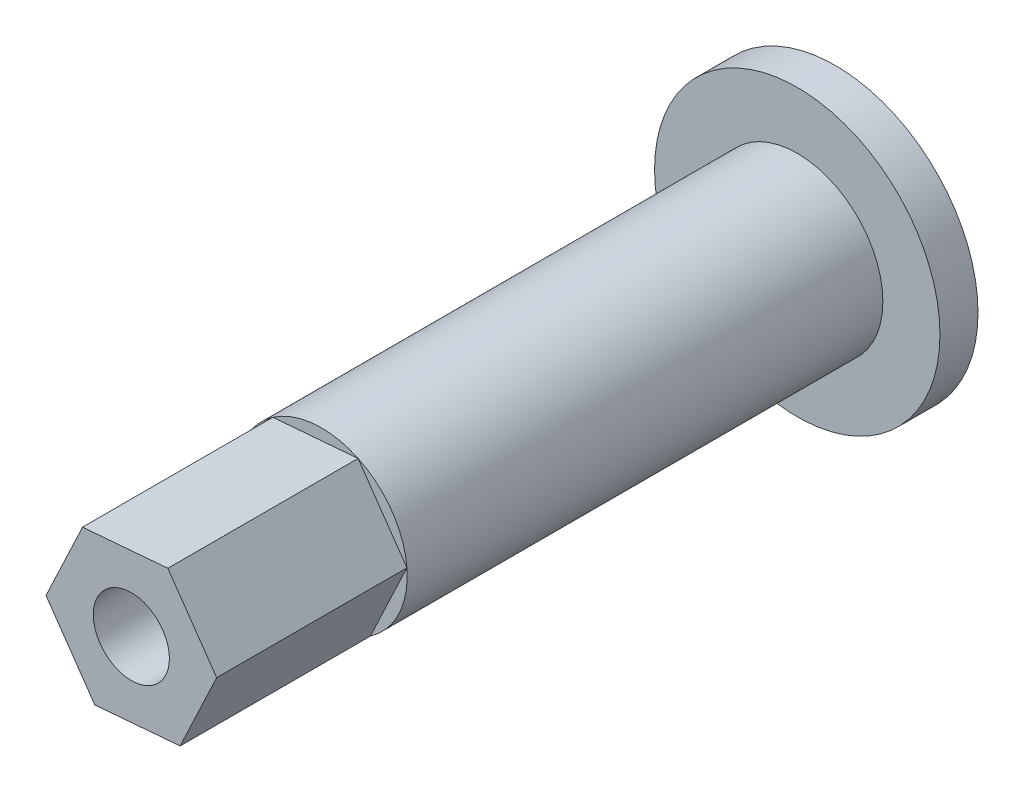
ISO-10303-21;
HEADER;
FILE_DESCRIPTION(('STEP AP214'),'2;1');
FILE_NAME('part.step','',(''),(''),'','','');
FILE_SCHEMA(('AUTOMOTIVE_DESIGN { 1 0 10303 214 1 1 1 1 }'));
ENDSEC;
DATA;
#1=APPLICATION_CONTEXT('core data for automotive mechanical design processes');
#2=APPLICATION_PROTOCOL_DEFINITION('international standard','automotive_design',2000,#1);
#3=PRODUCT_CONTEXT('',#1,'mechanical');
#4=PRODUCT('Part','Part','',(#3));
#5=PRODUCT_RELATED_PRODUCT_CATEGORY('part','',(#4));
#6=PRODUCT_DEFINITION_FORMATION('','',#4);
#7=PRODUCT_DEFINITION_CONTEXT('part definition',#1,'design');
#8=PRODUCT_DEFINITION('design','',#6,#7);
#9=PRODUCT_DEFINITION_SHAPE('','',#8);
#10=(LENGTH_UNIT() NAMED_UNIT(*) SI_UNIT(.MILLI.,.METRE.));
#11=(NAMED_UNIT(*) PLANE_ANGLE_UNIT() SI_UNIT($,.RADIAN.));
#12=(NAMED_UNIT(*) SI_UNIT($,.STERADIAN.) SOLID_ANGLE_UNIT());
#13=UNCERTAINTY_MEASURE_WITH_UNIT(LENGTH_MEASURE(1.E-05),#10,'distance_accuracy_value','');
#14=(GEOMETRIC_REPRESENTATION_CONTEXT(3) GLOBAL_UNCERTAINTY_ASSIGNED_CONTEXT((#13)) GLOBAL_UNIT_ASSIGNED_CONTEXT((#10,
#11,#12)) REPRESENTATION_CONTEXT('',''));
#15=CARTESIAN_POINT('',(0.,0.,0.));
#16=DIRECTION('',(0.,0.,1.));
#17=DIRECTION('',(1.,0.,0.));
#18=AXIS2_PLACEMENT_3D('',#15,#16,#17);
#19=CARTESIAN_POINT('',(0.,0.,25.));
#20=DIRECTION('',(0.,0.,1.));
#21=DIRECTION('',(1.,0.,0.));
#22=AXIS2_PLACEMENT_3D('',#19,#20,#21);
#23=PLANE('',#22);
#24=DIRECTION('',(-0.569748496318656,0.821819110840476,0.));
#25=VECTOR('',#24,1.);
#26=CARTESIAN_POINT('',(4.48465713958224,0.371282022718662,25.));
#27=LINE('',#26,#25);
#28=CARTESIAN_POINT('',(4.48465713958224,0.371282022718665,25.));
#29=VERTEX_POINT('',#28);
#30=CARTESIAN_POINT('',(1.92078890614829,4.0694680215008,25.));
#31=VERTEX_POINT('',#30);
#32=EDGE_CURVE('E150',#29,#31,#27,.T.);
#33=ORIENTED_EDGE('',*,*,#32,.F.);
#34=CARTESIAN_POINT('',(0.,0.,25.));
#35=DIRECTION('',(0.,0.,1.));
#36=DIRECTION('',(1.,0.,0.));
#37=AXIS2_PLACEMENT_3D('',#34,#35,#36);
#38=CIRCLE('',#37,4.5);
#39=EDGE_CURVE('E159',#29,#31,#38,.T.);
#40=ORIENTED_EDGE('',*,*,#39,.T.);
#41=EDGE_LOOP('',(#33,#40));
#42=FACE_BOUND('',#41,.T.);
#43=ADVANCED_FACE('F46',(#42),#23,.T.);
#44=DIRECTION('',(0.426841979144064,0.904326227000179,0.));
#45=VECTOR('',#44,1.);
#46=CARTESIAN_POINT('',(2.56386823343395,-3.69818599878214,25.));
#47=LINE('',#46,#45);
#48=CARTESIAN_POINT('',(2.56386823343395,-3.69818599878214,25.));
#49=VERTEX_POINT('',#48);
#50=EDGE_CURVE('E61',#49,#29,#47,.T.);
#51=ORIENTED_EDGE('',*,*,#50,.F.);
#52=EDGE_CURVE('E152',#49,#29,#38,.T.);
#53=ORIENTED_EDGE('',*,*,#52,.T.);
#54=EDGE_LOOP('',(#51,#53));
#55=FACE_BOUND('',#54,.T.);
#56=ADVANCED_FACE('F248',(#55),#23,.T.);
#57=DIRECTION('',(0.99659047546272,0.0825071161597027,0.));
#58=VECTOR('',#57,1.);
#59=CARTESIAN_POINT('',(-1.92078890614828,-4.0694680215008,25.));
#60=LINE('',#59,#58);
#61=CARTESIAN_POINT('',(-1.92078890614828,-4.06946802150081,25.));
#62=VERTEX_POINT('',#61);
#63=EDGE_CURVE('E68',#62,#49,#60,.T.);
#64=ORIENTED_EDGE('',*,*,#63,.F.);
#65=EDGE_CURVE('E157',#62,#49,#38,.T.);
#66=ORIENTED_EDGE('',*,*,#65,.T.);
#67=EDGE_LOOP('',(#64,#66));
#68=FACE_BOUND('',#67,.T.);
#69=ADVANCED_FACE('F253',(#68),#23,.T.);
#70=DIRECTION('',(0.569748496318656,-0.821819110840476,0.));
#71=VECTOR('',#70,1.);
#72=CARTESIAN_POINT('',(-4.48465713958223,-0.371282022718662,25.));
#73=LINE('',#72,#71);
#74=CARTESIAN_POINT('',(-4.48465713958224,-0.371282022718668,25.));
#75=VERTEX_POINT('',#74);
#76=EDGE_CURVE('E293',#75,#62,#73,.T.);
#77=ORIENTED_EDGE('',*,*,#76,.F.);
#78=EDGE_CURVE('E282',#75,#62,#38,.T.);
#79=ORIENTED_EDGE('',*,*,#78,.T.);
#80=EDGE_LOOP('',(#77,#79));
#81=FACE_BOUND('',#80,.T.);
#82=ADVANCED_FACE('F243',(#81),#23,.T.);
#83=DIRECTION('',(-0.426841979144064,-0.904326227000179,0.));
#84=VECTOR('',#83,1.);
#85=CARTESIAN_POINT('',(-2.56386823343395,3.69818599878214,25.));
#86=LINE('',#85,#84);
#87=CARTESIAN_POINT('',(-2.56386823343395,3.69818599878214,25.));
#88=VERTEX_POINT('',#87);
#89=EDGE_CURVE('E267',#88,#75,#86,.T.);
#90=ORIENTED_EDGE('',*,*,#89,.F.);
#91=EDGE_CURVE('E274',#88,#75,#38,.T.);
#92=ORIENTED_EDGE('',*,*,#91,.T.);
#93=EDGE_LOOP('',(#90,#92));
#94=FACE_BOUND('',#93,.T.);
#95=ADVANCED_FACE('F238',(#94),#23,.T.);
#96=CARTESIAN_POINT('',(0.,0.,10.));
#97=DIRECTION('',(0.,0.,-1.));
#98=DIRECTION('',(-1.,0.,0.));
#99=AXIS2_PLACEMENT_3D('',#96,#97,#98);
#100=CYLINDRICAL_SURFACE('',#99,2.7);
#101=DIRECTION('',(0.,0.,-1.));
#102=VECTOR('',#101,1.);
#103=CARTESIAN_POINT('',(-1.85,1.96659604392971,10.));
#104=LINE('',#103,#102);
#105=CARTESIAN_POINT('',(-1.85,1.96659604392971,10.));
#106=VERTEX_POINT('',#105);
#107=CARTESIAN_POINT('',(-1.85,1.96659604392971,-2.));
#108=VERTEX_POINT('',#107);
#109=EDGE_CURVE('E205',#106,#108,#104,.T.);
#110=ORIENTED_EDGE('',*,*,#109,.T.);
#111=CARTESIAN_POINT('',(0.,0.,-2.));
#112=DIRECTION('',(0.,0.,-1.));
#113=DIRECTION('',(-1.,0.,0.));
#114=AXIS2_PLACEMENT_3D('',#111,#112,#113);
#115=CIRCLE('',#114,2.7);
#116=CARTESIAN_POINT('',(1.85,1.96659604392972,-2.));
#117=VERTEX_POINT('',#116);
#118=EDGE_CURVE('E167',#108,#117,#115,.T.);
#119=ORIENTED_EDGE('',*,*,#118,.T.);
#120=DIRECTION('',(0.,0.,-1.));
#121=VECTOR('',#120,1.);
#122=CARTESIAN_POINT('',(1.85,1.96659604392972,10.));
#123=LINE('',#122,#121);
#124=CARTESIAN_POINT('',(1.85,1.96659604392972,10.));
#125=VERTEX_POINT('',#124);
#126=EDGE_CURVE('E11',#125,#117,#123,.T.);
#127=ORIENTED_EDGE('',*,*,#126,.F.);
#128=CARTESIAN_POINT('',(0.,0.,10.));
#129=DIRECTION('',(0.,0.,1.));
#130=DIRECTION('',(1.,0.,0.));
#131=AXIS2_PLACEMENT_3D('',#128,#129,#130);
#132=CIRCLE('',#131,2.7);
#133=EDGE_CURVE('E193',#106,#125,#132,.F.);
#134=ORIENTED_EDGE('',*,*,#133,.F.);
#135=EDGE_LOOP('',(#110,#119,#127,#134));
#136=FACE_BOUND('',#135,.T.);
#137=ADVANCED_FACE('F48',(#136),#100,.F.);
#138=CARTESIAN_POINT('',(1.85,0.,10.));
#139=DIRECTION('',(1.,0.,0.));
#140=DIRECTION('',(0.,0.,-1.));
#141=AXIS2_PLACEMENT_3D('',#138,#139,#140);
#142=PLANE('',#141);
#143=ORIENTED_EDGE('',*,*,#126,.T.);
#144=DIRECTION('',(0.,-1.,0.));
#145=VECTOR('',#144,1.);
#146=CARTESIAN_POINT('',(1.85,1.96659604392972,-2.));
#147=LINE('',#146,#145);
#148=CARTESIAN_POINT('',(1.85,-1.96659604392972,-2.));
#149=VERTEX_POINT('',#148);
#150=EDGE_CURVE('E172',#117,#149,#147,.T.);
#151=ORIENTED_EDGE('',*,*,#150,.T.);
#152=DIRECTION('',(0.,0.,-1.));
#153=VECTOR('',#152,1.);
#154=CARTESIAN_POINT('',(1.85,-1.96659604392972,10.));
#155=LINE('',#154,#153);
#156=CARTESIAN_POINT('',(1.85,-1.96659604392972,10.));
#157=VERTEX_POINT('',#156);
#158=EDGE_CURVE('E55',#157,#149,#155,.T.);
#159=ORIENTED_EDGE('',*,*,#158,.F.);
#160=DIRECTION('',(0.,-1.,0.));
#161=VECTOR('',#160,1.);
#162=CARTESIAN_POINT('',(1.85,0.,10.));
#163=LINE('',#162,#161);
#164=EDGE_CURVE('E195',#125,#157,#163,.T.);
#165=ORIENTED_EDGE('',*,*,#164,.F.);
#166=EDGE_LOOP('',(#143,#151,#159,#165));
#167=FACE_BOUND('',#166,.T.);
#168=ADVANCED_FACE('F225',(#167),#142,.F.);
#169=CARTESIAN_POINT('',(0.,0.,10.));
#170=DIRECTION('',(0.,0.,-1.));
#171=DIRECTION('',(-1.,0.,0.));
#172=AXIS2_PLACEMENT_3D('',#169,#170,#171);
#173=CYLINDRICAL_SURFACE('',#172,2.7);
#174=ORIENTED_EDGE('',*,*,#158,.T.);
#175=CARTESIAN_POINT('',(0.,0.,-2.));
#176=DIRECTION('',(0.,0.,-1.));
#177=DIRECTION('',(-1.,0.,0.));
#178=AXIS2_PLACEMENT_3D('',#175,#176,#177);
#179=CIRCLE('',#178,2.7);
#180=CARTESIAN_POINT('',(-1.85,-1.96659604392971,-2.));
#181=VERTEX_POINT('',#180);
#182=EDGE_CURVE('E176',#149,#181,#179,.T.);
#183=ORIENTED_EDGE('',*,*,#182,.T.);
#184=DIRECTION('',(0.,0.,-1.));
#185=VECTOR('',#184,1.);
#186=CARTESIAN_POINT('',(-1.85,-1.96659604392971,10.));
#187=LINE('',#186,#185);
#188=CARTESIAN_POINT('',(-1.85,-1.96659604392971,10.));
#189=VERTEX_POINT('',#188);
#190=EDGE_CURVE('E211',#189,#181,#187,.T.);
#191=ORIENTED_EDGE('',*,*,#190,.F.);
#192=CARTESIAN_POINT('',(0.,0.,10.));
#193=DIRECTION('',(0.,0.,1.));
#194=DIRECTION('',(1.,0.,0.));
#195=AXIS2_PLACEMENT_3D('',#192,#193,#194);
#196=CIRCLE('',#195,2.7);
#197=EDGE_CURVE('E198',#157,#189,#196,.F.);
#198=ORIENTED_EDGE('',*,*,#197,.F.);
#199=EDGE_LOOP('',(#174,#183,#191,#198));
#200=FACE_BOUND('',#199,.T.);
#201=ADVANCED_FACE('F218',(#200),#173,.F.);
#202=CARTESIAN_POINT('',(-1.85,0.,10.));
#203=DIRECTION('',(1.,0.,0.));
#204=DIRECTION('',(0.,0.,-1.));
#205=AXIS2_PLACEMENT_3D('',#202,#203,#204);
#206=PLANE('',#205);
#207=ORIENTED_EDGE('',*,*,#190,.T.);
#208=DIRECTION('',(0.,1.,0.));
#209=VECTOR('',#208,1.);
#210=CARTESIAN_POINT('',(-1.85,1.96659604392971,-2.));
#211=LINE('',#210,#209);
#212=EDGE_CURVE('E180',#181,#108,#211,.T.);
#213=ORIENTED_EDGE('',*,*,#212,.T.);
#214=ORIENTED_EDGE('',*,*,#109,.F.);
#215=DIRECTION('',(0.,-1.,0.));
#216=VECTOR('',#215,1.);
#217=CARTESIAN_POINT('',(-1.85,0.,10.));
#218=LINE('',#217,#216);
#219=EDGE_CURVE('E201',#106,#189,#218,.T.);
#220=ORIENTED_EDGE('',*,*,#219,.T.);
#221=EDGE_LOOP('',(#207,#213,#214,#220));
#222=FACE_BOUND('',#221,.T.);
#223=ADVANCED_FACE('F232',(#222),#206,.T.);
#224=CARTESIAN_POINT('',(0.,0.,10.));
#225=DIRECTION('',(0.,0.,-1.));
#226=DIRECTION('',(-1.,0.,0.));
#227=AXIS2_PLACEMENT_3D('',#224,#225,#226);
#228=CYLINDRICAL_SURFACE('',#227,4.5);
#229=CARTESIAN_POINT('',(0.,0.,0.));
#230=DIRECTION('',(0.,0.,1.));
#231=DIRECTION('',(1.,0.,0.));
#232=AXIS2_PLACEMENT_3D('',#229,#230,#231);
#233=CIRCLE('',#232,4.5);
#234=CARTESIAN_POINT('',(4.5,0.,0.));
#235=VERTEX_POINT('',#234);
#236=EDGE_CURVE('E189',#235,#235,#233,.T.);
#237=ORIENTED_EDGE('',*,*,#236,.T.);
#238=EDGE_LOOP('',(#237));
#239=FACE_BOUND('',#238,.T.);
#240=ORIENTED_EDGE('',*,*,#39,.F.);
#241=ORIENTED_EDGE('',*,*,#52,.F.);
#242=ORIENTED_EDGE('',*,*,#65,.F.);
#243=ORIENTED_EDGE('',*,*,#78,.F.);
#244=ORIENTED_EDGE('',*,*,#91,.F.);
#245=EDGE_CURVE('E168',#31,#88,#38,.T.);
#246=ORIENTED_EDGE('',*,*,#245,.F.);
#247=EDGE_LOOP('',(#240,#241,#242,#243,#244,#246));
#248=FACE_BOUND('',#247,.T.);
#249=ADVANCED_FACE('F271',(#239,#248),#228,.T.);
#250=CARTESIAN_POINT('',(0.,0.,-2.));
#251=DIRECTION('',(0.,0.,-1.));
#252=DIRECTION('',(-1.,0.,0.));
#253=AXIS2_PLACEMENT_3D('',#250,#251,#252);
#254=PLANE('',#253);
#255=CARTESIAN_POINT('',(0.,0.,-2.));
#256=DIRECTION('',(0.,0.,-1.));
#257=DIRECTION('',(-1.,0.,0.));
#258=AXIS2_PLACEMENT_3D('',#255,#256,#257);
#259=CIRCLE('',#258,7.5);
#260=CARTESIAN_POINT('',(-7.5,0.,-2.));
#261=VERTEX_POINT('',#260);
#262=EDGE_CURVE('E185',#261,#261,#259,.T.);
#263=ORIENTED_EDGE('',*,*,#262,.T.);
#264=EDGE_LOOP('',(#263));
#265=FACE_BOUND('',#264,.T.);
#266=ORIENTED_EDGE('',*,*,#150,.F.);
#267=ORIENTED_EDGE('',*,*,#118,.F.);
#268=ORIENTED_EDGE('',*,*,#212,.F.);
#269=ORIENTED_EDGE('',*,*,#182,.F.);
#270=EDGE_LOOP('',(#266,#267,#268,#269));
#271=FACE_BOUND('',#270,.T.);
#272=ADVANCED_FACE('F229',(#265,#271),#254,.T.);
#273=CARTESIAN_POINT('',(0.,0.,0.));
#274=DIRECTION('',(0.,0.,-1.));
#275=DIRECTION('',(-1.,0.,0.));
#276=AXIS2_PLACEMENT_3D('',#273,#274,#275);
#277=PLANE('',#276);
#278=ORIENTED_EDGE('',*,*,#236,.F.);
#279=EDGE_LOOP('',(#278));
#280=FACE_BOUND('',#279,.T.);
#281=CARTESIAN_POINT('',(0.,0.,0.));
#282=DIRECTION('',(0.,0.,-1.));
#283=DIRECTION('',(-1.,0.,0.));
#284=AXIS2_PLACEMENT_3D('',#281,#282,#283);
#285=CIRCLE('',#284,7.5);
#286=CARTESIAN_POINT('',(-7.5,0.,0.));
#287=VERTEX_POINT('',#286);
#288=EDGE_CURVE('E184',#287,#287,#285,.T.);
#289=ORIENTED_EDGE('',*,*,#288,.F.);
#290=EDGE_LOOP('',(#289));
#291=FACE_BOUND('',#290,.T.);
#292=ADVANCED_FACE('F558',(#280,#291),#277,.F.);
#293=CARTESIAN_POINT('',(0.,0.,-2.));
#294=DIRECTION('',(0.,0.,1.));
#295=DIRECTION('',(1.,0.,0.));
#296=AXIS2_PLACEMENT_3D('',#293,#294,#295);
#297=CYLINDRICAL_SURFACE('',#296,7.5);
#298=ORIENTED_EDGE('',*,*,#262,.F.);
#299=EDGE_LOOP('',(#298));
#300=FACE_BOUND('',#299,.T.);
#301=ORIENTED_EDGE('',*,*,#288,.T.);
#302=EDGE_LOOP('',(#301));
#303=FACE_BOUND('',#302,.T.);
#304=ADVANCED_FACE('F262',(#300,#303),#297,.T.);
#305=CARTESIAN_POINT('',(0.,0.,10.));
#306=DIRECTION('',(0.,0.,1.));
#307=DIRECTION('',(1.,0.,0.));
#308=AXIS2_PLACEMENT_3D('',#305,#306,#307);
#309=PLANE('',#308);
#310=ORIENTED_EDGE('',*,*,#219,.F.);
#311=ORIENTED_EDGE('',*,*,#133,.T.);
#312=ORIENTED_EDGE('',*,*,#164,.T.);
#313=ORIENTED_EDGE('',*,*,#197,.T.);
#314=EDGE_LOOP('',(#310,#311,#312,#313));
#315=FACE_BOUND('',#314,.T.);
#316=ADVANCED_FACE('F235',(#315),#309,.F.);
#317=DIRECTION('',(-0.99659047546272,-0.0825071161597025,0.));
#318=VECTOR('',#317,1.);
#319=CARTESIAN_POINT('',(1.92078890614829,4.0694680215008,25.));
#320=LINE('',#319,#318);
#321=EDGE_CURVE('E263',#31,#88,#320,.T.);
#322=ORIENTED_EDGE('',*,*,#321,.F.);
#323=ORIENTED_EDGE('',*,*,#245,.T.);
#324=EDGE_LOOP('',(#322,#323));
#325=FACE_BOUND('',#324,.T.);
#326=ADVANCED_FACE('F246',(#325),#23,.T.);
#327=CARTESIAN_POINT('',(4.48465713958224,0.371282022718662,35.));
#328=DIRECTION('',(-0.821819110840476,-0.569748496318656,0.));
#329=DIRECTION('',(0.569748496318656,-0.821819110840476,0.));
#330=AXIS2_PLACEMENT_3D('',#327,#328,#329);
#331=PLANE('',#330);
#332=ORIENTED_EDGE('',*,*,#32,.T.);
#333=DIRECTION('',(0.,0.,-1.));
#334=VECTOR('',#333,1.);
#335=CARTESIAN_POINT('',(1.92078890614829,4.0694680215008,35.));
#336=LINE('',#335,#334);
#337=CARTESIAN_POINT('',(1.92078890614829,4.0694680215008,35.));
#338=VERTEX_POINT('',#337);
#339=EDGE_CURVE('E130',#338,#31,#336,.T.);
#340=ORIENTED_EDGE('',*,*,#339,.F.);
#341=DIRECTION('',(-0.569748496318656,0.821819110840476,0.));
#342=VECTOR('',#341,1.);
#343=CARTESIAN_POINT('',(4.48465713958224,0.371282022718662,35.));
#344=LINE('',#343,#342);
#345=CARTESIAN_POINT('',(4.48465713958224,0.371282022718662,35.));
#346=VERTEX_POINT('',#345);
#347=EDGE_CURVE('E138',#346,#338,#344,.T.);
#348=ORIENTED_EDGE('',*,*,#347,.F.);
#349=DIRECTION('',(0.,0.,-1.));
#350=VECTOR('',#349,1.);
#351=CARTESIAN_POINT('',(4.48465713958224,0.371282022718662,35.));
#352=LINE('',#351,#350);
#353=EDGE_CURVE('E298',#346,#29,#352,.T.);
#354=ORIENTED_EDGE('',*,*,#353,.T.);
#355=EDGE_LOOP('',(#332,#340,#348,#354));
#356=FACE_BOUND('',#355,.T.);
#357=ADVANCED_FACE('F149',(#356),#331,.F.);
#358=CARTESIAN_POINT('',(1.92078890614829,4.0694680215008,35.));
#359=DIRECTION('',(0.0825071161597025,-0.99659047546272,0.));
#360=DIRECTION('',(0.99659047546272,0.0825071161597025,0.));
#361=AXIS2_PLACEMENT_3D('',#358,#359,#360);
#362=PLANE('',#361);
#363=ORIENTED_EDGE('',*,*,#321,.T.);
#364=DIRECTION('',(0.,0.,-1.));
#365=VECTOR('',#364,1.);
#366=CARTESIAN_POINT('',(-2.56386823343395,3.69818599878214,35.));
#367=LINE('',#366,#365);
#368=CARTESIAN_POINT('',(-2.56386823343395,3.69818599878214,35.));
#369=VERTEX_POINT('',#368);
#370=EDGE_CURVE('E133',#369,#88,#367,.T.);
#371=ORIENTED_EDGE('',*,*,#370,.F.);
#372=DIRECTION('',(-0.99659047546272,-0.0825071161597025,0.));
#373=VECTOR('',#372,1.);
#374=CARTESIAN_POINT('',(1.92078890614829,4.0694680215008,35.));
#375=LINE('',#374,#373);
#376=EDGE_CURVE('E125',#338,#369,#375,.T.);
#377=ORIENTED_EDGE('',*,*,#376,.F.);
#378=ORIENTED_EDGE('',*,*,#339,.T.);
#379=EDGE_LOOP('',(#363,#371,#377,#378));
#380=FACE_BOUND('',#379,.T.);
#381=ADVANCED_FACE('F128',(#380),#362,.F.);
#382=CARTESIAN_POINT('',(-2.56386823343395,3.69818599878214,35.));
#383=DIRECTION('',(0.904326227000179,-0.426841979144063,0.));
#384=DIRECTION('',(0.426841979144063,0.904326227000179,0.));
#385=AXIS2_PLACEMENT_3D('',#382,#383,#384);
#386=PLANE('',#385);
#387=ORIENTED_EDGE('',*,*,#89,.T.);
#388=DIRECTION('',(0.,0.,-1.));
#389=VECTOR('',#388,1.);
#390=CARTESIAN_POINT('',(-4.48465713958223,-0.371282022718662,35.));
#391=LINE('',#390,#389);
#392=CARTESIAN_POINT('',(-4.48465713958223,-0.371282022718662,35.));
#393=VERTEX_POINT('',#392);
#394=EDGE_CURVE('E161',#393,#75,#391,.T.);
#395=ORIENTED_EDGE('',*,*,#394,.F.);
#396=DIRECTION('',(-0.426841979144064,-0.904326227000179,0.));
#397=VECTOR('',#396,1.);
#398=CARTESIAN_POINT('',(-2.56386823343395,3.69818599878214,35.));
#399=LINE('',#398,#397);
#400=EDGE_CURVE('E137',#369,#393,#399,.T.);
#401=ORIENTED_EDGE('',*,*,#400,.F.);
#402=ORIENTED_EDGE('',*,*,#370,.T.);
#403=EDGE_LOOP('',(#387,#395,#401,#402));
#404=FACE_BOUND('',#403,.T.);
#405=ADVANCED_FACE('F319',(#404),#386,.F.);
#406=CARTESIAN_POINT('',(-4.48465713958223,-0.371282022718662,35.));
#407=DIRECTION('',(0.821819110840476,0.569748496318656,0.));
#408=DIRECTION('',(-0.569748496318656,0.821819110840476,0.));
#409=AXIS2_PLACEMENT_3D('',#406,#407,#408);
#410=PLANE('',#409);
#411=ORIENTED_EDGE('',*,*,#76,.T.);
#412=DIRECTION('',(0.,0.,-1.));
#413=VECTOR('',#412,1.);
#414=CARTESIAN_POINT('',(-1.92078890614828,-4.0694680215008,35.));
#415=LINE('',#414,#413);
#416=CARTESIAN_POINT('',(-1.92078890614828,-4.0694680215008,35.));
#417=VERTEX_POINT('',#416);
#418=EDGE_CURVE('E291',#417,#62,#415,.T.);
#419=ORIENTED_EDGE('',*,*,#418,.F.);
#420=DIRECTION('',(0.569748496318656,-0.821819110840476,0.));
#421=VECTOR('',#420,1.);
#422=CARTESIAN_POINT('',(-4.48465713958223,-0.371282022718662,35.));
#423=LINE('',#422,#421);
#424=EDGE_CURVE('E316',#393,#417,#423,.T.);
#425=ORIENTED_EDGE('',*,*,#424,.F.);
#426=ORIENTED_EDGE('',*,*,#394,.T.);
#427=EDGE_LOOP('',(#411,#419,#425,#426));
#428=FACE_BOUND('',#427,.T.);
#429=ADVANCED_FACE('F315',(#428),#410,.F.);
#430=CARTESIAN_POINT('',(-1.92078890614828,-4.0694680215008,35.));
#431=DIRECTION('',(-0.0825071161597027,0.99659047546272,0.));
#432=DIRECTION('',(-0.99659047546272,-0.0825071161597027,0.));
#433=AXIS2_PLACEMENT_3D('',#430,#431,#432);
#434=PLANE('',#433);
#435=ORIENTED_EDGE('',*,*,#63,.T.);
#436=DIRECTION('',(0.,0.,-1.));
#437=VECTOR('',#436,1.);
#438=CARTESIAN_POINT('',(2.56386823343395,-3.69818599878214,35.));
#439=LINE('',#438,#437);
#440=CARTESIAN_POINT('',(2.56386823343395,-3.69818599878214,35.));
#441=VERTEX_POINT('',#440);
#442=EDGE_CURVE('E289',#441,#49,#439,.T.);
#443=ORIENTED_EDGE('',*,*,#442,.F.);
#444=DIRECTION('',(0.99659047546272,0.0825071161597027,0.));
#445=VECTOR('',#444,1.);
#446=CARTESIAN_POINT('',(-1.92078890614828,-4.0694680215008,35.));
#447=LINE('',#446,#445);
#448=EDGE_CURVE('E342',#417,#441,#447,.T.);
#449=ORIENTED_EDGE('',*,*,#448,.F.);
#450=ORIENTED_EDGE('',*,*,#418,.T.);
#451=EDGE_LOOP('',(#435,#443,#449,#450));
#452=FACE_BOUND('',#451,.T.);
#453=ADVANCED_FACE('F287',(#452),#434,.F.);
#454=CARTESIAN_POINT('',(2.56386823343395,-3.69818599878214,35.));
#455=DIRECTION('',(-0.904326227000179,0.426841979144064,0.));
#456=DIRECTION('',(-0.426841979144064,-0.904326227000179,0.));
#457=AXIS2_PLACEMENT_3D('',#454,#455,#456);
#458=PLANE('',#457);
#459=ORIENTED_EDGE('',*,*,#50,.T.);
#460=ORIENTED_EDGE('',*,*,#353,.F.);
#461=DIRECTION('',(0.426841979144064,0.904326227000179,0.));
#462=VECTOR('',#461,1.);
#463=CARTESIAN_POINT('',(2.56386823343395,-3.69818599878214,35.));
#464=LINE('',#463,#462);
#465=EDGE_CURVE('E143',#441,#346,#464,.T.);
#466=ORIENTED_EDGE('',*,*,#465,.F.);
#467=ORIENTED_EDGE('',*,*,#442,.T.);
#468=EDGE_LOOP('',(#459,#460,#466,#467));
#469=FACE_BOUND('',#468,.T.);
#470=ADVANCED_FACE('F296',(#469),#458,.F.);
#471=CARTESIAN_POINT('',(0.,0.,35.));
#472=DIRECTION('',(0.,0.,1.));
#473=DIRECTION('',(1.,0.,0.));
#474=AXIS2_PLACEMENT_3D('',#471,#472,#473);
#475=PLANE('',#474);
#476=CARTESIAN_POINT('',(0.,0.,35.));
#477=DIRECTION('',(0.,0.,1.));
#478=DIRECTION('',(1.,0.,0.));
#479=AXIS2_PLACEMENT_3D('',#476,#477,#478);
#480=CIRCLE('',#479,2.);
#481=CARTESIAN_POINT('',(2.,0.,35.));
#482=VERTEX_POINT('',#481);
#483=EDGE_CURVE('E330',#482,#482,#480,.T.);
#484=ORIENTED_EDGE('',*,*,#483,.F.);
#485=EDGE_LOOP('',(#484));
#486=FACE_BOUND('',#485,.T.);
#487=ORIENTED_EDGE('',*,*,#347,.T.);
#488=ORIENTED_EDGE('',*,*,#376,.T.);
#489=ORIENTED_EDGE('',*,*,#400,.T.);
#490=ORIENTED_EDGE('',*,*,#424,.T.);
#491=ORIENTED_EDGE('',*,*,#448,.T.);
#492=ORIENTED_EDGE('',*,*,#465,.T.);
#493=EDGE_LOOP('',(#487,#488,#489,#490,#491,#492));
#494=FACE_BOUND('',#493,.T.);
#495=ADVANCED_FACE('F141',(#486,#494),#475,.T.);
#496=CARTESIAN_POINT('',(0.,0.,29.));
#497=DIRECTION('',(0.,0.,1.));
#498=DIRECTION('',(1.,0.,0.));
#499=AXIS2_PLACEMENT_3D('',#496,#497,#498);
#500=CYLINDRICAL_SURFACE('',#499,2.);
#501=CARTESIAN_POINT('',(0.,0.,29.));
#502=DIRECTION('',(0.,0.,1.));
#503=DIRECTION('',(1.,0.,0.));
#504=AXIS2_PLACEMENT_3D('',#501,#502,#503);
#505=CIRCLE('',#504,2.);
#506=CARTESIAN_POINT('',(2.,0.,29.));
#507=VERTEX_POINT('',#506);
#508=EDGE_CURVE('E278',#507,#507,#505,.T.);
#509=ORIENTED_EDGE('',*,*,#508,.F.);
#510=EDGE_LOOP('',(#509));
#511=FACE_BOUND('',#510,.T.);
#512=ORIENTED_EDGE('',*,*,#483,.T.);
#513=EDGE_LOOP('',(#512));
#514=FACE_BOUND('',#513,.T.);
#515=ADVANCED_FACE('F382',(#511,#514),#500,.F.);
#516=CARTESIAN_POINT('',(0.,0.,29.));
#517=DIRECTION('',(0.,0.,1.));
#518=DIRECTION('',(1.,0.,0.));
#519=AXIS2_PLACEMENT_3D('',#516,#517,#518);
#520=PLANE('',#519);
#521=ORIENTED_EDGE('',*,*,#508,.T.);
#522=EDGE_LOOP('',(#521));
#523=FACE_BOUND('',#522,.T.);
#524=ADVANCED_FACE('F380',(#523),#520,.T.);
#525=CLOSED_SHELL('',(#43,#56,#69,#82,#95,#137,#168,#201,#223,#249,#272,#292,#304,#316,#326,
#357,#381,#405,#429,#453,#470,#495,#515,#524));
#526=MANIFOLD_SOLID_BREP('B2',#525);
#527=ADVANCED_BREP_SHAPE_REPRESENTATION('',(#18,#526),#14);
#528=SHAPE_DEFINITION_REPRESENTATION(#9,#527);
ENDSEC;
END-ISO-10303-21;
